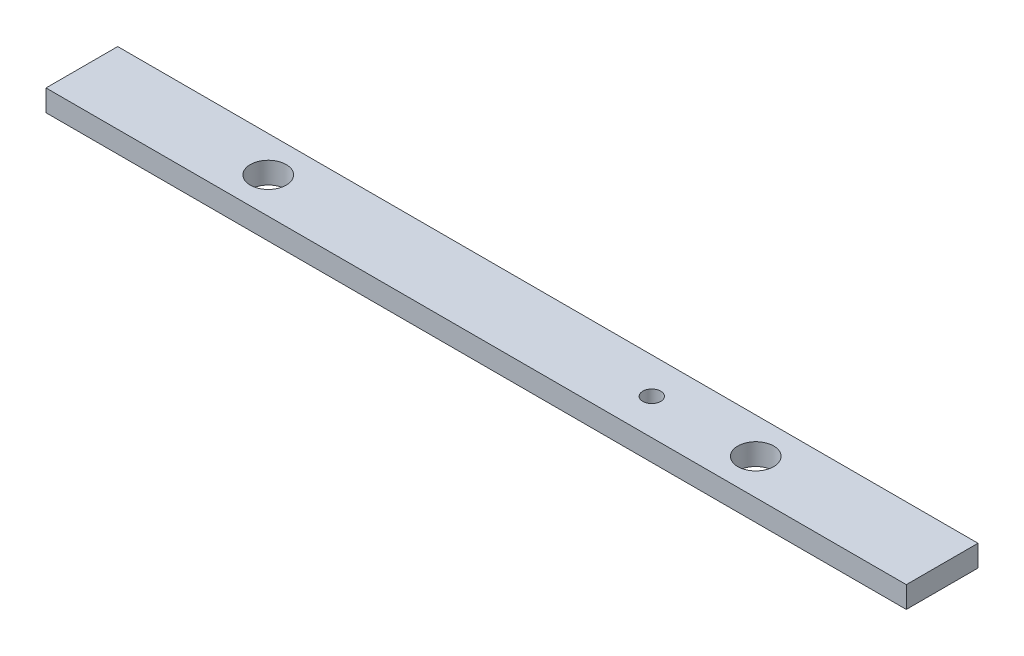
ISO-10303-21;
HEADER;
FILE_DESCRIPTION(('STEP AP214'),'2;1');
FILE_NAME('part.step','',(''),(''),'','','');
FILE_SCHEMA(('AUTOMOTIVE_DESIGN { 1 0 10303 214 1 1 1 1 }'));
ENDSEC;
DATA;
#1=APPLICATION_CONTEXT('core data for automotive mechanical design processes');
#2=APPLICATION_PROTOCOL_DEFINITION('international standard','automotive_design',2000,#1);
#3=PRODUCT_CONTEXT('',#1,'mechanical');
#4=PRODUCT('Part','Part','',(#3));
#5=PRODUCT_RELATED_PRODUCT_CATEGORY('part','',(#4));
#6=PRODUCT_DEFINITION_FORMATION('','',#4);
#7=PRODUCT_DEFINITION_CONTEXT('part definition',#1,'design');
#8=PRODUCT_DEFINITION('design','',#6,#7);
#9=PRODUCT_DEFINITION_SHAPE('','',#8);
#10=(LENGTH_UNIT() NAMED_UNIT(*) SI_UNIT(.MILLI.,.METRE.));
#11=(NAMED_UNIT(*) PLANE_ANGLE_UNIT() SI_UNIT($,.RADIAN.));
#12=(NAMED_UNIT(*) SI_UNIT($,.STERADIAN.) SOLID_ANGLE_UNIT());
#13=UNCERTAINTY_MEASURE_WITH_UNIT(LENGTH_MEASURE(1.E-05),#10,'distance_accuracy_value','');
#14=(GEOMETRIC_REPRESENTATION_CONTEXT(3) GLOBAL_UNCERTAINTY_ASSIGNED_CONTEXT((#13)) GLOBAL_UNIT_ASSIGNED_CONTEXT((#10,
#11,#12)) REPRESENTATION_CONTEXT('',''));
#15=CARTESIAN_POINT('',(0.,0.,0.));
#16=DIRECTION('',(0.,0.,1.));
#17=DIRECTION('',(1.,0.,0.));
#18=AXIS2_PLACEMENT_3D('',#15,#16,#17);
#19=CARTESIAN_POINT('',(60.,3.,5.));
#20=DIRECTION('',(-1.,0.,0.));
#21=DIRECTION('',(0.,0.,1.));
#22=AXIS2_PLACEMENT_3D('',#19,#20,#21);
#23=PLANE('',#22);
#24=DIRECTION('',(0.,0.,-1.));
#25=VECTOR('',#24,1.);
#26=CARTESIAN_POINT('',(60.,0.,5.));
#27=LINE('',#26,#25);
#28=CARTESIAN_POINT('',(60.,0.,5.));
#29=VERTEX_POINT('',#28);
#30=CARTESIAN_POINT('',(60.,0.,-5.));
#31=VERTEX_POINT('',#30);
#32=EDGE_CURVE('E113',#29,#31,#27,.T.);
#33=ORIENTED_EDGE('',*,*,#32,.T.);
#34=DIRECTION('',(0.,-1.,0.));
#35=VECTOR('',#34,1.);
#36=CARTESIAN_POINT('',(60.,3.,-5.));
#37=LINE('',#36,#35);
#38=CARTESIAN_POINT('',(60.,3.,-5.));
#39=VERTEX_POINT('',#38);
#40=EDGE_CURVE('E11',#39,#31,#37,.T.);
#41=ORIENTED_EDGE('',*,*,#40,.F.);
#42=DIRECTION('',(0.,0.,-1.));
#43=VECTOR('',#42,1.);
#44=CARTESIAN_POINT('',(60.,3.,5.));
#45=LINE('',#44,#43);
#46=CARTESIAN_POINT('',(60.,3.,5.));
#47=VERTEX_POINT('',#46);
#48=EDGE_CURVE('E97',#47,#39,#45,.T.);
#49=ORIENTED_EDGE('',*,*,#48,.F.);
#50=DIRECTION('',(0.,-1.,0.));
#51=VECTOR('',#50,1.);
#52=CARTESIAN_POINT('',(60.,3.,5.));
#53=LINE('',#52,#51);
#54=EDGE_CURVE('E109',#47,#29,#53,.T.);
#55=ORIENTED_EDGE('',*,*,#54,.T.);
#56=EDGE_LOOP('',(#33,#41,#49,#55));
#57=FACE_BOUND('',#56,.T.);
#58=ADVANCED_FACE('F45',(#57),#23,.F.);
#59=CARTESIAN_POINT('',(-60.,3.,-5.));
#60=DIRECTION('',(0.,0.,1.));
#61=DIRECTION('',(1.,0.,0.));
#62=AXIS2_PLACEMENT_3D('',#59,#60,#61);
#63=PLANE('',#62);
#64=DIRECTION('',(-1.,0.,0.));
#65=VECTOR('',#64,1.);
#66=CARTESIAN_POINT('',(-60.,0.,-5.));
#67=LINE('',#66,#65);
#68=CARTESIAN_POINT('',(-60.,0.,-5.));
#69=VERTEX_POINT('',#68);
#70=EDGE_CURVE('E102',#31,#69,#67,.T.);
#71=ORIENTED_EDGE('',*,*,#70,.T.);
#72=DIRECTION('',(0.,-1.,0.));
#73=VECTOR('',#72,1.);
#74=CARTESIAN_POINT('',(-60.,3.,-5.));
#75=LINE('',#74,#73);
#76=CARTESIAN_POINT('',(-60.,3.,-5.));
#77=VERTEX_POINT('',#76);
#78=EDGE_CURVE('E54',#77,#69,#75,.T.);
#79=ORIENTED_EDGE('',*,*,#78,.F.);
#80=DIRECTION('',(-1.,0.,0.));
#81=VECTOR('',#80,1.);
#82=CARTESIAN_POINT('',(-60.,3.,-5.));
#83=LINE('',#82,#81);
#84=EDGE_CURVE('E92',#39,#77,#83,.T.);
#85=ORIENTED_EDGE('',*,*,#84,.F.);
#86=ORIENTED_EDGE('',*,*,#40,.T.);
#87=EDGE_LOOP('',(#71,#79,#85,#86));
#88=FACE_BOUND('',#87,.T.);
#89=ADVANCED_FACE('F101',(#88),#63,.F.);
#90=CARTESIAN_POINT('',(-60.,3.,5.));
#91=DIRECTION('',(1.,0.,0.));
#92=DIRECTION('',(0.,0.,-1.));
#93=AXIS2_PLACEMENT_3D('',#90,#91,#92);
#94=PLANE('',#93);
#95=DIRECTION('',(0.,0.,1.));
#96=VECTOR('',#95,1.);
#97=CARTESIAN_POINT('',(-60.,0.,5.));
#98=LINE('',#97,#96);
#99=CARTESIAN_POINT('',(-60.,0.,5.));
#100=VERTEX_POINT('',#99);
#101=EDGE_CURVE('E79',#69,#100,#98,.T.);
#102=ORIENTED_EDGE('',*,*,#101,.T.);
#103=DIRECTION('',(0.,-1.,0.));
#104=VECTOR('',#103,1.);
#105=CARTESIAN_POINT('',(-60.,3.,5.));
#106=LINE('',#105,#104);
#107=CARTESIAN_POINT('',(-60.,3.,5.));
#108=VERTEX_POINT('',#107);
#109=EDGE_CURVE('E104',#108,#100,#106,.T.);
#110=ORIENTED_EDGE('',*,*,#109,.F.);
#111=DIRECTION('',(0.,0.,1.));
#112=VECTOR('',#111,1.);
#113=CARTESIAN_POINT('',(-60.,3.,5.));
#114=LINE('',#113,#112);
#115=EDGE_CURVE('E95',#77,#108,#114,.T.);
#116=ORIENTED_EDGE('',*,*,#115,.F.);
#117=ORIENTED_EDGE('',*,*,#78,.T.);
#118=EDGE_LOOP('',(#102,#110,#116,#117));
#119=FACE_BOUND('',#118,.T.);
#120=ADVANCED_FACE('F105',(#119),#94,.F.);
#121=CARTESIAN_POINT('',(-60.,3.,5.));
#122=DIRECTION('',(0.,0.,-1.));
#123=DIRECTION('',(-1.,0.,0.));
#124=AXIS2_PLACEMENT_3D('',#121,#122,#123);
#125=PLANE('',#124);
#126=DIRECTION('',(1.,0.,0.));
#127=VECTOR('',#126,1.);
#128=CARTESIAN_POINT('',(-60.,0.,5.));
#129=LINE('',#128,#127);
#130=EDGE_CURVE('E85',#100,#29,#129,.T.);
#131=ORIENTED_EDGE('',*,*,#130,.T.);
#132=ORIENTED_EDGE('',*,*,#54,.F.);
#133=DIRECTION('',(1.,0.,0.));
#134=VECTOR('',#133,1.);
#135=CARTESIAN_POINT('',(-60.,3.,5.));
#136=LINE('',#135,#134);
#137=EDGE_CURVE('E62',#108,#47,#136,.T.);
#138=ORIENTED_EDGE('',*,*,#137,.F.);
#139=ORIENTED_EDGE('',*,*,#109,.T.);
#140=EDGE_LOOP('',(#131,#132,#138,#139));
#141=FACE_BOUND('',#140,.T.);
#142=ADVANCED_FACE('F127',(#141),#125,.F.);
#143=CARTESIAN_POINT('',(0.,3.,0.));
#144=DIRECTION('',(0.,-1.,0.));
#145=DIRECTION('',(0.,0.,-1.));
#146=AXIS2_PLACEMENT_3D('',#143,#144,#145);
#147=PLANE('',#146);
#148=CARTESIAN_POINT('',(-34.,3.,0.));
#149=DIRECTION('',(0.,-1.,0.));
#150=DIRECTION('',(0.,0.,-1.));
#151=AXIS2_PLACEMENT_3D('',#148,#149,#150);
#152=CIRCLE('',#151,2.5);
#153=CARTESIAN_POINT('',(-34.,3.,-2.5));
#154=VERTEX_POINT('',#153);
#155=EDGE_CURVE('E117',#154,#154,#152,.T.);
#156=ORIENTED_EDGE('',*,*,#155,.T.);
#157=EDGE_LOOP('',(#156));
#158=FACE_BOUND('',#157,.T.);
#159=CARTESIAN_POINT('',(34.,3.,0.));
#160=DIRECTION('',(0.,-1.,0.));
#161=DIRECTION('',(0.,0.,-1.));
#162=AXIS2_PLACEMENT_3D('',#159,#160,#161);
#163=CIRCLE('',#162,2.50000000000001);
#164=CARTESIAN_POINT('',(34.,3.,-2.50000000000002));
#165=VERTEX_POINT('',#164);
#166=EDGE_CURVE('E138',#165,#165,#163,.T.);
#167=ORIENTED_EDGE('',*,*,#166,.T.);
#168=EDGE_LOOP('',(#167));
#169=FACE_BOUND('',#168,.T.);
#170=CARTESIAN_POINT('',(19.5,3.,0.));
#171=DIRECTION('',(0.,-1.,0.));
#172=DIRECTION('',(0.,0.,-1.));
#173=AXIS2_PLACEMENT_3D('',#170,#171,#172);
#174=CIRCLE('',#173,1.2499999999997);
#175=CARTESIAN_POINT('',(19.5,3.,-1.2499999999997));
#176=VERTEX_POINT('',#175);
#177=EDGE_CURVE('E139',#176,#176,#174,.T.);
#178=ORIENTED_EDGE('',*,*,#177,.T.);
#179=EDGE_LOOP('',(#178));
#180=FACE_BOUND('',#179,.T.);
#181=ORIENTED_EDGE('',*,*,#48,.T.);
#182=ORIENTED_EDGE('',*,*,#84,.T.);
#183=ORIENTED_EDGE('',*,*,#115,.T.);
#184=ORIENTED_EDGE('',*,*,#137,.T.);
#185=EDGE_LOOP('',(#181,#182,#183,#184));
#186=FACE_BOUND('',#185,.T.);
#187=ADVANCED_FACE('F93',(#158,#169,#180,#186),#147,.F.);
#188=CARTESIAN_POINT('',(0.,0.,0.));
#189=DIRECTION('',(0.,-1.,0.));
#190=DIRECTION('',(0.,0.,-1.));
#191=AXIS2_PLACEMENT_3D('',#188,#189,#190);
#192=PLANE('',#191);
#193=CARTESIAN_POINT('',(-34.,0.,0.));
#194=DIRECTION('',(0.,1.,0.));
#195=DIRECTION('',(0.,0.,1.));
#196=AXIS2_PLACEMENT_3D('',#193,#194,#195);
#197=CIRCLE('',#196,2.5);
#198=CARTESIAN_POINT('',(-34.,0.,-2.5));
#199=VERTEX_POINT('',#198);
#200=EDGE_CURVE('E147',#199,#199,#197,.T.);
#201=ORIENTED_EDGE('',*,*,#200,.T.);
#202=EDGE_LOOP('',(#201));
#203=FACE_BOUND('',#202,.T.);
#204=CARTESIAN_POINT('',(34.,0.,0.));
#205=DIRECTION('',(0.,1.,0.));
#206=DIRECTION('',(0.,0.,-1.));
#207=AXIS2_PLACEMENT_3D('',#204,#205,#206);
#208=CIRCLE('',#207,2.50000000000001);
#209=CARTESIAN_POINT('',(34.,0.,-2.50000000000002));
#210=VERTEX_POINT('',#209);
#211=EDGE_CURVE('E143',#210,#210,#208,.T.);
#212=ORIENTED_EDGE('',*,*,#211,.T.);
#213=EDGE_LOOP('',(#212));
#214=FACE_BOUND('',#213,.T.);
#215=CARTESIAN_POINT('',(19.5,0.,0.));
#216=DIRECTION('',(0.,1.,0.));
#217=DIRECTION('',(0.,0.,1.));
#218=AXIS2_PLACEMENT_3D('',#215,#216,#217);
#219=CIRCLE('',#218,1.2499999999997);
#220=CARTESIAN_POINT('',(19.5,0.,-1.2499999999997));
#221=VERTEX_POINT('',#220);
#222=EDGE_CURVE('E134',#221,#221,#219,.T.);
#223=ORIENTED_EDGE('',*,*,#222,.T.);
#224=EDGE_LOOP('',(#223));
#225=FACE_BOUND('',#224,.T.);
#226=ORIENTED_EDGE('',*,*,#32,.F.);
#227=ORIENTED_EDGE('',*,*,#130,.F.);
#228=ORIENTED_EDGE('',*,*,#101,.F.);
#229=ORIENTED_EDGE('',*,*,#70,.F.);
#230=EDGE_LOOP('',(#226,#227,#228,#229));
#231=FACE_BOUND('',#230,.T.);
#232=ADVANCED_FACE('F130',(#203,#214,#225,#231),#192,.T.);
#233=CARTESIAN_POINT('',(19.5,10.0710678118655,0.));
#234=DIRECTION('',(0.,-1.,0.));
#235=DIRECTION('',(0.,0.,-1.));
#236=AXIS2_PLACEMENT_3D('',#233,#234,#235);
#237=CYLINDRICAL_SURFACE('',#236,1.2499999999997);
#238=CARTESIAN_POINT('',(19.5,3.,-1.2499999999997));
#239=CARTESIAN_POINT('',(19.5,2.96875,-1.2499999999997));
#240=CARTESIAN_POINT('',(19.5,2.9375,-1.2499999999997));
#241=CARTESIAN_POINT('',(19.5,2.875,-1.2499999999997));
#242=CARTESIAN_POINT('',(19.5,2.84375,-1.2499999999997));
#243=CARTESIAN_POINT('',(19.5,2.78125,-1.2499999999997));
#244=CARTESIAN_POINT('',(19.5,2.75,-1.2499999999997));
#245=CARTESIAN_POINT('',(19.5,2.6875,-1.2499999999997));
#246=CARTESIAN_POINT('',(19.5,2.65625,-1.2499999999997));
#247=CARTESIAN_POINT('',(19.5,2.59375,-1.2499999999997));
#248=CARTESIAN_POINT('',(19.5,2.5625,-1.2499999999997));
#249=CARTESIAN_POINT('',(19.5,2.5,-1.2499999999997));
#250=CARTESIAN_POINT('',(19.5,2.46875,-1.2499999999997));
#251=CARTESIAN_POINT('',(19.5,2.40625,-1.2499999999997));
#252=CARTESIAN_POINT('',(19.5,2.375,-1.2499999999997));
#253=CARTESIAN_POINT('',(19.5,2.3125,-1.2499999999997));
#254=CARTESIAN_POINT('',(19.5,2.28125,-1.2499999999997));
#255=CARTESIAN_POINT('',(19.5,2.21875,-1.2499999999997));
#256=CARTESIAN_POINT('',(19.5,2.1875,-1.2499999999997));
#257=CARTESIAN_POINT('',(19.5,2.125,-1.2499999999997));
#258=CARTESIAN_POINT('',(19.5,2.09375,-1.2499999999997));
#259=CARTESIAN_POINT('',(19.5,2.03125,-1.2499999999997));
#260=CARTESIAN_POINT('',(19.5,2.,-1.2499999999997));
#261=CARTESIAN_POINT('',(19.5,1.9375,-1.2499999999997));
#262=CARTESIAN_POINT('',(19.5,1.90625,-1.2499999999997));
#263=CARTESIAN_POINT('',(19.5,1.84375,-1.2499999999997));
#264=CARTESIAN_POINT('',(19.5,1.8125,-1.2499999999997));
#265=CARTESIAN_POINT('',(19.5,1.75,-1.2499999999997));
#266=CARTESIAN_POINT('',(19.5,1.71875,-1.2499999999997));
#267=CARTESIAN_POINT('',(19.5,1.65625,-1.2499999999997));
#268=CARTESIAN_POINT('',(19.5,1.625,-1.2499999999997));
#269=CARTESIAN_POINT('',(19.5,1.5625,-1.2499999999997));
#270=CARTESIAN_POINT('',(19.5,1.53125,-1.2499999999997));
#271=CARTESIAN_POINT('',(19.5,1.46875,-1.2499999999997));
#272=CARTESIAN_POINT('',(19.5,1.4375,-1.2499999999997));
#273=CARTESIAN_POINT('',(19.5,1.375,-1.2499999999997));
#274=CARTESIAN_POINT('',(19.5,1.34375,-1.2499999999997));
#275=CARTESIAN_POINT('',(19.5,1.28125,-1.2499999999997));
#276=CARTESIAN_POINT('',(19.5,1.25,-1.2499999999997));
#277=CARTESIAN_POINT('',(19.5,1.1875,-1.2499999999997));
#278=CARTESIAN_POINT('',(19.5,1.15625,-1.2499999999997));
#279=CARTESIAN_POINT('',(19.5,1.09375,-1.2499999999997));
#280=CARTESIAN_POINT('',(19.5,1.0625,-1.2499999999997));
#281=CARTESIAN_POINT('',(19.5,0.999999999999999,-1.2499999999997));
#282=CARTESIAN_POINT('',(19.5,0.968749999999999,-1.2499999999997));
#283=CARTESIAN_POINT('',(19.5,0.906249999999999,-1.2499999999997));
#284=CARTESIAN_POINT('',(19.5,0.874999999999999,-1.2499999999997));
#285=CARTESIAN_POINT('',(19.5,0.812499999999999,-1.2499999999997));
#286=CARTESIAN_POINT('',(19.5,0.781249999999999,-1.2499999999997));
#287=CARTESIAN_POINT('',(19.5,0.718749999999999,-1.2499999999997));
#288=CARTESIAN_POINT('',(19.5,0.687499999999999,-1.2499999999997));
#289=CARTESIAN_POINT('',(19.5,0.624999999999999,-1.2499999999997));
#290=CARTESIAN_POINT('',(19.5,0.593749999999999,-1.2499999999997));
#291=CARTESIAN_POINT('',(19.5,0.531249999999999,-1.2499999999997));
#292=CARTESIAN_POINT('',(19.5,0.499999999999999,-1.2499999999997));
#293=CARTESIAN_POINT('',(19.5,0.437499999999999,-1.2499999999997));
#294=CARTESIAN_POINT('',(19.5,0.406249999999999,-1.2499999999997));
#295=CARTESIAN_POINT('',(19.5,0.343749999999999,-1.2499999999997));
#296=CARTESIAN_POINT('',(19.5,0.312499999999999,-1.2499999999997));
#297=CARTESIAN_POINT('',(19.5,0.249999999999999,-1.2499999999997));
#298=CARTESIAN_POINT('',(19.5,0.218749999999998,-1.2499999999997));
#299=CARTESIAN_POINT('',(19.5,0.156249999999998,-1.2499999999997));
#300=CARTESIAN_POINT('',(19.5,0.124999999999998,-1.2499999999997));
#301=CARTESIAN_POINT('',(19.5,0.0624999999999983,-1.2499999999997));
#302=CARTESIAN_POINT('',(19.5,0.0312499999999983,-1.2499999999997));
#303=CARTESIAN_POINT('',(19.5,0.,-1.2499999999997));
#304=B_SPLINE_CURVE_WITH_KNOTS('',3,(#238,#239,#240,#241,#242,#243,#244,#245,#246,#247,#248,
#249,#250,#251,#252,#253,#254,#255,#256,#257,#258,#259,#260,#261,#262,#263,#264,#265,#266,#267,
#268,#269,#270,#271,#272,#273,#274,#275,#276,#277,#278,#279,#280,#281,#282,#283,#284,#285,#286,
#287,#288,#289,#290,#291,#292,#293,#294,#295,#296,#297,#298,#299,#300,#301,#302,#303),
.UNSPECIFIED.,.F.,.F.,(4,2,2,2,2,2,2,2,2,2,2,2,2,2,2,2,2,2,2,2,2,2,2,2,2,2,2,2,2,2,2,2,4),(0.,
0.0937500000000001,0.1875,0.28125,0.375,0.46875,0.5625,0.656250000000001,0.75,0.84375,0.9375,
1.03125,1.125,1.21875,1.3125,1.40625,1.5,1.59375,1.6875,1.78125,1.875,1.96875,2.0625,2.15625,
2.25,2.34375,2.4375,2.53125,2.625,2.71875,2.8125,2.90625,3.),.UNSPECIFIED.);
#305=EDGE_CURVE('BSEAM168',#176,#221,#304,.T.);
#306=ORIENTED_EDGE('',*,*,#177,.F.);
#307=ORIENTED_EDGE('',*,*,#222,.F.);
#308=ORIENTED_EDGE('',*,*,#305,.T.);
#309=ORIENTED_EDGE('',*,*,#305,.F.);
#310=EDGE_LOOP('',(#306,#308,#307,#309));
#311=FACE_BOUND('',#310,.T.);
#312=ADVANCED_FACE('F168',(#311),#237,.F.);
#313=CARTESIAN_POINT('',(34.,10.0710678118655,0.));
#314=DIRECTION('',(0.,-1.,0.));
#315=DIRECTION('',(0.,0.,-1.));
#316=AXIS2_PLACEMENT_3D('',#313,#314,#315);
#317=CYLINDRICAL_SURFACE('',#316,2.50000000000001);
#318=CARTESIAN_POINT('',(34.,3.,-2.50000000000002));
#319=CARTESIAN_POINT('',(34.,2.96875,-2.50000000000002));
#320=CARTESIAN_POINT('',(34.,2.9375,-2.50000000000002));
#321=CARTESIAN_POINT('',(34.,2.875,-2.50000000000002));
#322=CARTESIAN_POINT('',(34.,2.84375,-2.50000000000002));
#323=CARTESIAN_POINT('',(34.,2.78125,-2.50000000000002));
#324=CARTESIAN_POINT('',(34.,2.75,-2.50000000000002));
#325=CARTESIAN_POINT('',(34.,2.6875,-2.50000000000002));
#326=CARTESIAN_POINT('',(34.,2.65625,-2.50000000000002));
#327=CARTESIAN_POINT('',(34.,2.59375,-2.50000000000002));
#328=CARTESIAN_POINT('',(34.,2.5625,-2.50000000000002));
#329=CARTESIAN_POINT('',(34.,2.5,-2.50000000000002));
#330=CARTESIAN_POINT('',(34.,2.46875,-2.50000000000002));
#331=CARTESIAN_POINT('',(34.,2.40625,-2.50000000000002));
#332=CARTESIAN_POINT('',(34.,2.375,-2.50000000000002));
#333=CARTESIAN_POINT('',(34.,2.3125,-2.50000000000002));
#334=CARTESIAN_POINT('',(34.,2.28125,-2.50000000000002));
#335=CARTESIAN_POINT('',(34.,2.21875,-2.50000000000002));
#336=CARTESIAN_POINT('',(34.,2.1875,-2.50000000000002));
#337=CARTESIAN_POINT('',(34.,2.125,-2.50000000000002));
#338=CARTESIAN_POINT('',(34.,2.09375,-2.50000000000002));
#339=CARTESIAN_POINT('',(34.,2.03125,-2.50000000000002));
#340=CARTESIAN_POINT('',(34.,2.,-2.50000000000002));
#341=CARTESIAN_POINT('',(34.,1.9375,-2.50000000000002));
#342=CARTESIAN_POINT('',(34.,1.90625,-2.50000000000002));
#343=CARTESIAN_POINT('',(34.,1.84375,-2.50000000000002));
#344=CARTESIAN_POINT('',(34.,1.8125,-2.50000000000002));
#345=CARTESIAN_POINT('',(34.,1.75,-2.50000000000002));
#346=CARTESIAN_POINT('',(34.,1.71875,-2.50000000000002));
#347=CARTESIAN_POINT('',(34.,1.65625,-2.50000000000002));
#348=CARTESIAN_POINT('',(34.,1.625,-2.50000000000002));
#349=CARTESIAN_POINT('',(34.,1.5625,-2.50000000000002));
#350=CARTESIAN_POINT('',(34.,1.53125,-2.50000000000002));
#351=CARTESIAN_POINT('',(34.,1.46875,-2.50000000000002));
#352=CARTESIAN_POINT('',(34.,1.4375,-2.50000000000002));
#353=CARTESIAN_POINT('',(34.,1.375,-2.50000000000002));
#354=CARTESIAN_POINT('',(34.,1.34375,-2.50000000000002));
#355=CARTESIAN_POINT('',(34.,1.28125,-2.50000000000002));
#356=CARTESIAN_POINT('',(34.,1.25,-2.50000000000002));
#357=CARTESIAN_POINT('',(34.,1.1875,-2.50000000000002));
#358=CARTESIAN_POINT('',(34.,1.15625,-2.50000000000002));
#359=CARTESIAN_POINT('',(34.,1.09375,-2.50000000000002));
#360=CARTESIAN_POINT('',(34.,1.0625,-2.50000000000002));
#361=CARTESIAN_POINT('',(34.,0.999999999999999,-2.50000000000002));
#362=CARTESIAN_POINT('',(34.,0.968749999999999,-2.50000000000002));
#363=CARTESIAN_POINT('',(34.,0.906249999999999,-2.50000000000002));
#364=CARTESIAN_POINT('',(34.,0.874999999999999,-2.50000000000002));
#365=CARTESIAN_POINT('',(34.,0.812499999999999,-2.50000000000002));
#366=CARTESIAN_POINT('',(34.,0.781249999999999,-2.50000000000002));
#367=CARTESIAN_POINT('',(34.,0.718749999999999,-2.50000000000002));
#368=CARTESIAN_POINT('',(34.,0.687499999999999,-2.50000000000002));
#369=CARTESIAN_POINT('',(34.,0.624999999999999,-2.50000000000002));
#370=CARTESIAN_POINT('',(34.,0.593749999999999,-2.50000000000002));
#371=CARTESIAN_POINT('',(34.,0.531249999999999,-2.50000000000002));
#372=CARTESIAN_POINT('',(34.,0.499999999999999,-2.50000000000002));
#373=CARTESIAN_POINT('',(34.,0.437499999999999,-2.50000000000002));
#374=CARTESIAN_POINT('',(34.,0.406249999999999,-2.50000000000002));
#375=CARTESIAN_POINT('',(34.,0.343749999999999,-2.50000000000002));
#376=CARTESIAN_POINT('',(34.,0.312499999999999,-2.50000000000002));
#377=CARTESIAN_POINT('',(34.,0.249999999999999,-2.50000000000002));
#378=CARTESIAN_POINT('',(34.,0.218749999999998,-2.50000000000002));
#379=CARTESIAN_POINT('',(34.,0.156249999999998,-2.50000000000002));
#380=CARTESIAN_POINT('',(34.,0.124999999999998,-2.50000000000002));
#381=CARTESIAN_POINT('',(34.,0.0624999999999983,-2.50000000000002));
#382=CARTESIAN_POINT('',(34.,0.0312499999999983,-2.50000000000002));
#383=CARTESIAN_POINT('',(34.,0.,-2.50000000000002));
#384=B_SPLINE_CURVE_WITH_KNOTS('',3,(#318,#319,#320,#321,#322,#323,#324,#325,#326,#327,#328,
#329,#330,#331,#332,#333,#334,#335,#336,#337,#338,#339,#340,#341,#342,#343,#344,#345,#346,#347,
#348,#349,#350,#351,#352,#353,#354,#355,#356,#357,#358,#359,#360,#361,#362,#363,#364,#365,#366,
#367,#368,#369,#370,#371,#372,#373,#374,#375,#376,#377,#378,#379,#380,#381,#382,#383),
.UNSPECIFIED.,.F.,.F.,(4,2,2,2,2,2,2,2,2,2,2,2,2,2,2,2,2,2,2,2,2,2,2,2,2,2,2,2,2,2,2,2,4),(0.,
0.0937500000000001,0.1875,0.28125,0.375,0.46875,0.5625,0.656250000000001,0.75,0.84375,0.9375,
1.03125,1.125,1.21875,1.3125,1.40625,1.5,1.59375,1.6875,1.78125,1.875,1.96875,2.0625,2.15625,
2.25,2.34375,2.4375,2.53125,2.625,2.71875,2.8125,2.90625,3.),.UNSPECIFIED.);
#385=EDGE_CURVE('BSEAM162',#165,#210,#384,.T.);
#386=ORIENTED_EDGE('',*,*,#166,.F.);
#387=ORIENTED_EDGE('',*,*,#211,.F.);
#388=ORIENTED_EDGE('',*,*,#385,.T.);
#389=ORIENTED_EDGE('',*,*,#385,.F.);
#390=EDGE_LOOP('',(#386,#388,#387,#389));
#391=FACE_BOUND('',#390,.T.);
#392=ADVANCED_FACE('F162',(#391),#317,.F.);
#393=CARTESIAN_POINT('',(-34.,10.0710678118655,0.));
#394=DIRECTION('',(0.,-1.,0.));
#395=DIRECTION('',(0.,0.,-1.));
#396=AXIS2_PLACEMENT_3D('',#393,#394,#395);
#397=CYLINDRICAL_SURFACE('',#396,2.5);
#398=CARTESIAN_POINT('',(-34.,3.,-2.5));
#399=CARTESIAN_POINT('',(-34.,2.96875,-2.5));
#400=CARTESIAN_POINT('',(-34.,2.9375,-2.5));
#401=CARTESIAN_POINT('',(-34.,2.875,-2.5));
#402=CARTESIAN_POINT('',(-34.,2.84375,-2.5));
#403=CARTESIAN_POINT('',(-34.,2.78125,-2.5));
#404=CARTESIAN_POINT('',(-34.,2.75,-2.5));
#405=CARTESIAN_POINT('',(-34.,2.6875,-2.5));
#406=CARTESIAN_POINT('',(-34.,2.65625,-2.5));
#407=CARTESIAN_POINT('',(-34.,2.59375,-2.5));
#408=CARTESIAN_POINT('',(-34.,2.5625,-2.5));
#409=CARTESIAN_POINT('',(-34.,2.5,-2.5));
#410=CARTESIAN_POINT('',(-34.,2.46875,-2.5));
#411=CARTESIAN_POINT('',(-34.,2.40625,-2.5));
#412=CARTESIAN_POINT('',(-34.,2.375,-2.5));
#413=CARTESIAN_POINT('',(-34.,2.3125,-2.5));
#414=CARTESIAN_POINT('',(-34.,2.28125,-2.5));
#415=CARTESIAN_POINT('',(-34.,2.21875,-2.5));
#416=CARTESIAN_POINT('',(-34.,2.1875,-2.5));
#417=CARTESIAN_POINT('',(-34.,2.125,-2.5));
#418=CARTESIAN_POINT('',(-34.,2.09375,-2.5));
#419=CARTESIAN_POINT('',(-34.,2.03125,-2.5));
#420=CARTESIAN_POINT('',(-34.,2.,-2.5));
#421=CARTESIAN_POINT('',(-34.,1.9375,-2.5));
#422=CARTESIAN_POINT('',(-34.,1.90625,-2.5));
#423=CARTESIAN_POINT('',(-34.,1.84375,-2.5));
#424=CARTESIAN_POINT('',(-34.,1.8125,-2.5));
#425=CARTESIAN_POINT('',(-34.,1.75,-2.5));
#426=CARTESIAN_POINT('',(-34.,1.71875,-2.5));
#427=CARTESIAN_POINT('',(-34.,1.65625,-2.5));
#428=CARTESIAN_POINT('',(-34.,1.625,-2.5));
#429=CARTESIAN_POINT('',(-34.,1.5625,-2.5));
#430=CARTESIAN_POINT('',(-34.,1.53125,-2.5));
#431=CARTESIAN_POINT('',(-34.,1.46875,-2.5));
#432=CARTESIAN_POINT('',(-34.,1.4375,-2.5));
#433=CARTESIAN_POINT('',(-34.,1.375,-2.5));
#434=CARTESIAN_POINT('',(-34.,1.34375,-2.5));
#435=CARTESIAN_POINT('',(-34.,1.28125,-2.5));
#436=CARTESIAN_POINT('',(-34.,1.25,-2.5));
#437=CARTESIAN_POINT('',(-34.,1.1875,-2.5));
#438=CARTESIAN_POINT('',(-34.,1.15625,-2.5));
#439=CARTESIAN_POINT('',(-34.,1.09375,-2.5));
#440=CARTESIAN_POINT('',(-34.,1.0625,-2.5));
#441=CARTESIAN_POINT('',(-34.,0.999999999999999,-2.5));
#442=CARTESIAN_POINT('',(-34.,0.968749999999999,-2.5));
#443=CARTESIAN_POINT('',(-34.,0.906249999999999,-2.5));
#444=CARTESIAN_POINT('',(-34.,0.874999999999999,-2.5));
#445=CARTESIAN_POINT('',(-34.,0.812499999999999,-2.5));
#446=CARTESIAN_POINT('',(-34.,0.781249999999999,-2.5));
#447=CARTESIAN_POINT('',(-34.,0.718749999999999,-2.5));
#448=CARTESIAN_POINT('',(-34.,0.687499999999999,-2.5));
#449=CARTESIAN_POINT('',(-34.,0.624999999999999,-2.5));
#450=CARTESIAN_POINT('',(-34.,0.593749999999999,-2.5));
#451=CARTESIAN_POINT('',(-34.,0.531249999999999,-2.5));
#452=CARTESIAN_POINT('',(-34.,0.499999999999999,-2.5));
#453=CARTESIAN_POINT('',(-34.,0.437499999999999,-2.5));
#454=CARTESIAN_POINT('',(-34.,0.406249999999999,-2.5));
#455=CARTESIAN_POINT('',(-34.,0.343749999999999,-2.5));
#456=CARTESIAN_POINT('',(-34.,0.312499999999999,-2.5));
#457=CARTESIAN_POINT('',(-34.,0.249999999999999,-2.5));
#458=CARTESIAN_POINT('',(-34.,0.218749999999998,-2.5));
#459=CARTESIAN_POINT('',(-34.,0.156249999999998,-2.5));
#460=CARTESIAN_POINT('',(-34.,0.124999999999998,-2.5));
#461=CARTESIAN_POINT('',(-34.,0.0624999999999983,-2.5));
#462=CARTESIAN_POINT('',(-34.,0.0312499999999983,-2.5));
#463=CARTESIAN_POINT('',(-34.,0.,-2.5));
#464=B_SPLINE_CURVE_WITH_KNOTS('',3,(#398,#399,#400,#401,#402,#403,#404,#405,#406,#407,#408,
#409,#410,#411,#412,#413,#414,#415,#416,#417,#418,#419,#420,#421,#422,#423,#424,#425,#426,#427,
#428,#429,#430,#431,#432,#433,#434,#435,#436,#437,#438,#439,#440,#441,#442,#443,#444,#445,#446,
#447,#448,#449,#450,#451,#452,#453,#454,#455,#456,#457,#458,#459,#460,#461,#462,#463),
.UNSPECIFIED.,.F.,.F.,(4,2,2,2,2,2,2,2,2,2,2,2,2,2,2,2,2,2,2,2,2,2,2,2,2,2,2,2,2,2,2,2,4),(0.,
0.0937500000000001,0.1875,0.28125,0.375,0.46875,0.5625,0.656250000000001,0.75,0.84375,0.9375,
1.03125,1.125,1.21875,1.3125,1.40625,1.5,1.59375,1.6875,1.78125,1.875,1.96875,2.0625,2.15625,
2.25,2.34375,2.4375,2.53125,2.625,2.71875,2.8125,2.90625,3.),.UNSPECIFIED.);
#465=EDGE_CURVE('BSEAM160',#154,#199,#464,.T.);
#466=ORIENTED_EDGE('',*,*,#155,.F.);
#467=ORIENTED_EDGE('',*,*,#200,.F.);
#468=ORIENTED_EDGE('',*,*,#465,.T.);
#469=ORIENTED_EDGE('',*,*,#465,.F.);
#470=EDGE_LOOP('',(#466,#468,#467,#469));
#471=FACE_BOUND('',#470,.T.);
#472=ADVANCED_FACE('F160',(#471),#397,.F.);
#473=CLOSED_SHELL('',(#58,#89,#120,#142,#187,#232,#312,#392,#472));
#474=MANIFOLD_SOLID_BREP('B2',#473);
#475=ADVANCED_BREP_SHAPE_REPRESENTATION('',(#18,#474),#14);
#476=SHAPE_DEFINITION_REPRESENTATION(#9,#475);
ENDSEC;
END-ISO-10303-21;
